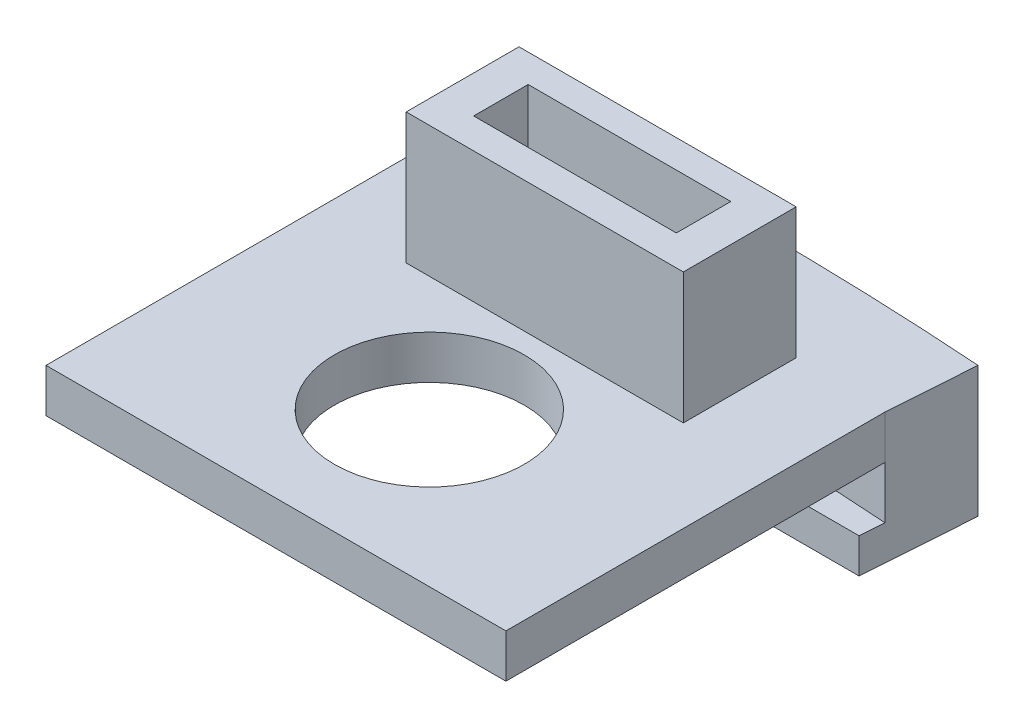
ISO-10303-21;
HEADER;
FILE_DESCRIPTION(('STEP AP214'),'2;1');
FILE_NAME('part.step','',(''),(''),'','','');
FILE_SCHEMA(('AUTOMOTIVE_DESIGN { 1 0 10303 214 1 1 1 1 }'));
ENDSEC;
DATA;
#1=APPLICATION_CONTEXT('core data for automotive mechanical design processes');
#2=APPLICATION_PROTOCOL_DEFINITION('international standard','automotive_design',2000,#1);
#3=PRODUCT_CONTEXT('',#1,'mechanical');
#4=PRODUCT('Part','Part','',(#3));
#5=PRODUCT_RELATED_PRODUCT_CATEGORY('part','',(#4));
#6=PRODUCT_DEFINITION_FORMATION('','',#4);
#7=PRODUCT_DEFINITION_CONTEXT('part definition',#1,'design');
#8=PRODUCT_DEFINITION('design','',#6,#7);
#9=PRODUCT_DEFINITION_SHAPE('','',#8);
#10=(LENGTH_UNIT() NAMED_UNIT(*) SI_UNIT(.MILLI.,.METRE.));
#11=(NAMED_UNIT(*) PLANE_ANGLE_UNIT() SI_UNIT($,.RADIAN.));
#12=(NAMED_UNIT(*) SI_UNIT($,.STERADIAN.) SOLID_ANGLE_UNIT());
#13=UNCERTAINTY_MEASURE_WITH_UNIT(LENGTH_MEASURE(1.E-05),#10,'distance_accuracy_value','');
#14=(GEOMETRIC_REPRESENTATION_CONTEXT(3) GLOBAL_UNCERTAINTY_ASSIGNED_CONTEXT((#13)) GLOBAL_UNIT_ASSIGNED_CONTEXT((#10,
#11,#12)) REPRESENTATION_CONTEXT('',''));
#15=CARTESIAN_POINT('',(0.,0.,0.));
#16=DIRECTION('',(0.,0.,1.));
#17=DIRECTION('',(1.,0.,0.));
#18=AXIS2_PLACEMENT_3D('',#15,#16,#17);
#19=CARTESIAN_POINT('',(0.,0.,0.));
#20=DIRECTION('',(0.,1.,0.));
#21=DIRECTION('',(0.,0.,1.));
#22=AXIS2_PLACEMENT_3D('',#19,#20,#21);
#23=PLANE('',#22);
#24=DIRECTION('',(1.,0.,0.));
#25=VECTOR('',#24,1.);
#26=CARTESIAN_POINT('',(0.,0.,1.9558));
#27=LINE('',#26,#25);
#28=CARTESIAN_POINT('',(-5.9055,0.,1.9558));
#29=VERTEX_POINT('',#28);
#30=CARTESIAN_POINT('',(5.9055,0.,1.9558));
#31=VERTEX_POINT('',#30);
#32=EDGE_CURVE('E173',#29,#31,#27,.T.);
#33=ORIENTED_EDGE('',*,*,#32,.F.);
#34=DIRECTION('',(0.,0.,1.));
#35=VECTOR('',#34,1.);
#36=CARTESIAN_POINT('',(-5.9055,0.,0.));
#37=LINE('',#36,#35);
#38=CARTESIAN_POINT('',(-5.9055,0.,5.1308));
#39=VERTEX_POINT('',#38);
#40=EDGE_CURVE('E154',#29,#39,#37,.T.);
#41=ORIENTED_EDGE('',*,*,#40,.T.);
#42=DIRECTION('',(1.,0.,0.));
#43=VECTOR('',#42,1.);
#44=CARTESIAN_POINT('',(0.,0.,5.1308));
#45=LINE('',#44,#43);
#46=CARTESIAN_POINT('',(5.9055,0.,5.1308));
#47=VERTEX_POINT('',#46);
#48=EDGE_CURVE('E177',#39,#47,#45,.T.);
#49=ORIENTED_EDGE('',*,*,#48,.T.);
#50=DIRECTION('',(0.,0.,1.));
#51=VECTOR('',#50,1.);
#52=CARTESIAN_POINT('',(5.9055,0.,0.));
#53=LINE('',#52,#51);
#54=EDGE_CURVE('E175',#31,#47,#53,.T.);
#55=ORIENTED_EDGE('',*,*,#54,.F.);
#56=EDGE_LOOP('',(#33,#41,#49,#55));
#57=FACE_BOUND('',#56,.T.);
#58=CARTESIAN_POINT('',(0.,0.,13.62075));
#59=DIRECTION('',(0.,1.,0.));
#60=DIRECTION('',(0.,0.,1.));
#61=AXIS2_PLACEMENT_3D('',#58,#59,#60);
#62=CIRCLE('',#61,5.53085);
#63=CARTESIAN_POINT('',(0.,0.,19.1516));
#64=VERTEX_POINT('',#63);
#65=EDGE_CURVE('E162',#64,#64,#62,.T.);
#66=ORIENTED_EDGE('',*,*,#65,.T.);
#67=EDGE_LOOP('',(#66));
#68=FACE_BOUND('',#67,.T.);
#69=CARTESIAN_POINT('',(0.,0.,192.0875));
#70=DIRECTION('',(0.,1.,0.));
#71=DIRECTION('',(0.,0.,1.));
#72=AXIS2_PLACEMENT_3D('',#69,#70,#71);
#73=CIRCLE('',#72,192.0875);
#74=CARTESIAN_POINT('',(13.3993466503233,0.,0.467915495715926));
#75=VERTEX_POINT('',#74);
#76=CARTESIAN_POINT('',(-13.3993466503233,0.,0.467915495715926));
#77=VERTEX_POINT('',#76);
#78=EDGE_CURVE('E298',#75,#77,#73,.T.);
#79=ORIENTED_EDGE('',*,*,#78,.F.);
#80=DIRECTION('',(0.,0.,1.));
#81=VECTOR('',#80,1.);
#82=CARTESIAN_POINT('',(13.3993466503233,0.,0.));
#83=LINE('',#82,#81);
#84=CARTESIAN_POINT('',(13.3993466503233,0.,22.5570249983964));
#85=VERTEX_POINT('',#84);
#86=EDGE_CURVE('E165',#75,#85,#83,.T.);
#87=ORIENTED_EDGE('',*,*,#86,.T.);
#88=DIRECTION('',(1.,0.,0.));
#89=VECTOR('',#88,1.);
#90=CARTESIAN_POINT('',(0.,0.,22.5570249983964));
#91=LINE('',#90,#89);
#92=CARTESIAN_POINT('',(-13.3993466503233,0.,22.5570249983964));
#93=VERTEX_POINT('',#92);
#94=EDGE_CURVE('E171',#93,#85,#91,.T.);
#95=ORIENTED_EDGE('',*,*,#94,.F.);
#96=DIRECTION('',(0.,0.,1.));
#97=VECTOR('',#96,1.);
#98=CARTESIAN_POINT('',(-13.3993466503233,0.,0.));
#99=LINE('',#98,#97);
#100=EDGE_CURVE('E169',#77,#93,#99,.T.);
#101=ORIENTED_EDGE('',*,*,#100,.F.);
#102=EDGE_LOOP('',(#79,#87,#95,#101));
#103=FACE_BOUND('',#102,.T.);
#104=ADVANCED_FACE('F35',(#57,#68,#103),#23,.F.);
#105=CARTESIAN_POINT('',(0.,2.54,1.9558));
#106=DIRECTION('',(0.,0.,-1.));
#107=DIRECTION('',(-1.,0.,0.));
#108=AXIS2_PLACEMENT_3D('',#105,#106,#107);
#109=PLANE('',#108);
#110=ORIENTED_EDGE('',*,*,#32,.T.);
#111=DIRECTION('',(0.,-1.,0.));
#112=VECTOR('',#111,1.);
#113=CARTESIAN_POINT('',(5.9055,2.54,1.9558));
#114=LINE('',#113,#112);
#115=CARTESIAN_POINT('',(5.9055,10.16,1.9558));
#116=VERTEX_POINT('',#115);
#117=EDGE_CURVE('E43',#116,#31,#114,.T.);
#118=ORIENTED_EDGE('',*,*,#117,.F.);
#119=DIRECTION('',(1.,0.,0.));
#120=VECTOR('',#119,1.);
#121=CARTESIAN_POINT('',(0.,10.16,1.9558));
#122=LINE('',#121,#120);
#123=CARTESIAN_POINT('',(-5.9055,10.16,1.9558));
#124=VERTEX_POINT('',#123);
#125=EDGE_CURVE('E284',#124,#116,#122,.T.);
#126=ORIENTED_EDGE('',*,*,#125,.F.);
#127=DIRECTION('',(0.,-1.,0.));
#128=VECTOR('',#127,1.);
#129=CARTESIAN_POINT('',(-5.9055,2.54,1.9558));
#130=LINE('',#129,#128);
#131=EDGE_CURVE('E90',#124,#29,#130,.T.);
#132=ORIENTED_EDGE('',*,*,#131,.T.);
#133=EDGE_LOOP('',(#110,#118,#126,#132));
#134=FACE_BOUND('',#133,.T.);
#135=ADVANCED_FACE('F359',(#134),#109,.F.);
#136=CARTESIAN_POINT('',(5.9055,2.54,0.));
#137=DIRECTION('',(1.,0.,0.));
#138=DIRECTION('',(0.,0.,-1.));
#139=AXIS2_PLACEMENT_3D('',#136,#137,#138);
#140=PLANE('',#139);
#141=ORIENTED_EDGE('',*,*,#54,.T.);
#142=DIRECTION('',(0.,-1.,0.));
#143=VECTOR('',#142,1.);
#144=CARTESIAN_POINT('',(5.9055,2.54,5.1308));
#145=LINE('',#144,#143);
#146=CARTESIAN_POINT('',(5.9055,10.16,5.1308));
#147=VERTEX_POINT('',#146);
#148=EDGE_CURVE('E151',#147,#47,#145,.T.);
#149=ORIENTED_EDGE('',*,*,#148,.F.);
#150=DIRECTION('',(0.,0.,1.));
#151=VECTOR('',#150,1.);
#152=CARTESIAN_POINT('',(5.9055,10.16,0.));
#153=LINE('',#152,#151);
#154=EDGE_CURVE('E281',#116,#147,#153,.T.);
#155=ORIENTED_EDGE('',*,*,#154,.F.);
#156=ORIENTED_EDGE('',*,*,#117,.T.);
#157=EDGE_LOOP('',(#141,#149,#155,#156));
#158=FACE_BOUND('',#157,.T.);
#159=ADVANCED_FACE('F364',(#158),#140,.F.);
#160=CARTESIAN_POINT('',(0.,2.54,5.1308));
#161=DIRECTION('',(0.,0.,-1.));
#162=DIRECTION('',(-1.,0.,0.));
#163=AXIS2_PLACEMENT_3D('',#160,#161,#162);
#164=PLANE('',#163);
#165=ORIENTED_EDGE('',*,*,#48,.F.);
#166=DIRECTION('',(0.,-1.,0.));
#167=VECTOR('',#166,1.);
#168=CARTESIAN_POINT('',(-5.9055,2.54,5.1308));
#169=LINE('',#168,#167);
#170=CARTESIAN_POINT('',(-5.9055,10.16,5.1308));
#171=VERTEX_POINT('',#170);
#172=EDGE_CURVE('E149',#171,#39,#169,.T.);
#173=ORIENTED_EDGE('',*,*,#172,.F.);
#174=DIRECTION('',(1.,0.,0.));
#175=VECTOR('',#174,1.);
#176=CARTESIAN_POINT('',(0.,10.16,5.1308));
#177=LINE('',#176,#175);
#178=EDGE_CURVE('E278',#171,#147,#177,.T.);
#179=ORIENTED_EDGE('',*,*,#178,.T.);
#180=ORIENTED_EDGE('',*,*,#148,.T.);
#181=EDGE_LOOP('',(#165,#173,#179,#180));
#182=FACE_BOUND('',#181,.T.);
#183=ADVANCED_FACE('F374',(#182),#164,.T.);
#184=CARTESIAN_POINT('',(13.3993466503233,2.54,0.));
#185=DIRECTION('',(1.,0.,0.));
#186=DIRECTION('',(0.,0.,-1.));
#187=AXIS2_PLACEMENT_3D('',#184,#185,#186);
#188=PLANE('',#187);
#189=ORIENTED_EDGE('',*,*,#86,.F.);
#190=DIRECTION('',(0.,-1.,0.));
#191=VECTOR('',#190,1.);
#192=CARTESIAN_POINT('',(13.3993466503233,2.54,0.467915495715926));
#193=LINE('',#192,#191);
#194=CARTESIAN_POINT('',(13.3993466503233,2.54,0.467915495715926));
#195=VERTEX_POINT('',#194);
#196=EDGE_CURVE('E99',#195,#75,#193,.T.);
#197=ORIENTED_EDGE('',*,*,#196,.F.);
#198=DIRECTION('',(0.,0.,1.));
#199=VECTOR('',#198,1.);
#200=CARTESIAN_POINT('',(13.3993466503233,2.54,0.));
#201=LINE('',#200,#199);
#202=CARTESIAN_POINT('',(13.3993466503233,2.54,22.5570249983964));
#203=VERTEX_POINT('',#202);
#204=EDGE_CURVE('E185',#195,#203,#201,.T.);
#205=ORIENTED_EDGE('',*,*,#204,.T.);
#206=DIRECTION('',(0.,-1.,0.));
#207=VECTOR('',#206,1.);
#208=CARTESIAN_POINT('',(13.3993466503233,2.54,22.5570249983964));
#209=LINE('',#208,#207);
#210=EDGE_CURVE('E141',#203,#85,#209,.T.);
#211=ORIENTED_EDGE('',*,*,#210,.T.);
#212=EDGE_LOOP('',(#189,#197,#205,#211));
#213=FACE_BOUND('',#212,.T.);
#214=ADVANCED_FACE('F343',(#213),#188,.T.);
#215=CARTESIAN_POINT('',(13.3667065153319,2.54,0.934691172801612));
#216=DIRECTION('',(0.997564050259825,0.,0.0697564737441179));
#217=DIRECTION('',(0.0697564737441179,0.,-0.997564050259825));
#218=AXIS2_PLACEMENT_3D('',#215,#216,#217);
#219=PLANE('',#218);
#220=DIRECTION('',(0.,1.,0.));
#221=VECTOR('',#220,1.);
#222=CARTESIAN_POINT('',(13.3993466503233,-5.08,0.467915495715926));
#223=LINE('',#222,#221);
#224=CARTESIAN_POINT('',(13.3993466503233,-3.048,0.467915495715926));
#225=VERTEX_POINT('',#224);
#226=EDGE_CURVE('E294',#225,#75,#223,.T.);
#227=ORIENTED_EDGE('',*,*,#226,.F.);
#228=DIRECTION('',(-0.0697564737441179,0.,0.997564050259825));
#229=VECTOR('',#228,1.);
#230=CARTESIAN_POINT('',(13.7535788992914,-3.048,-4.59784167414245));
#231=LINE('',#230,#229);
#232=CARTESIAN_POINT('',(13.3006711291802,-3.048,1.87904119129026));
#233=VERTEX_POINT('',#232);
#234=EDGE_CURVE('E314',#225,#233,#231,.T.);
#235=ORIENTED_EDGE('',*,*,#234,.T.);
#236=DIRECTION('',(0.,-1.,0.));
#237=VECTOR('',#236,1.);
#238=CARTESIAN_POINT('',(13.3006711291802,-3.048,1.87904119129026));
#239=LINE('',#238,#237);
#240=CARTESIAN_POINT('',(13.3006711291802,-5.08,1.87904119129026));
#241=VERTEX_POINT('',#240);
#242=EDGE_CURVE('E306',#233,#241,#239,.T.);
#243=ORIENTED_EDGE('',*,*,#242,.T.);
#244=DIRECTION('',(-0.0697564737441179,0.,0.997564050259825));
#245=VECTOR('',#244,1.);
#246=CARTESIAN_POINT('',(13.3667065153319,-5.08,0.934691172801612));
#247=LINE('',#246,#245);
#248=CARTESIAN_POINT('',(13.7535788992914,-5.08,-4.59784167414245));
#249=VERTEX_POINT('',#248);
#250=EDGE_CURVE('E296',#249,#241,#247,.T.);
#251=ORIENTED_EDGE('',*,*,#250,.F.);
#252=DIRECTION('',(0.,-1.,0.));
#253=VECTOR('',#252,1.);
#254=CARTESIAN_POINT('',(13.7535788992914,2.54,-4.59784167414245));
#255=LINE('',#254,#253);
#256=CARTESIAN_POINT('',(13.7535788992914,2.54,-4.59784167414245));
#257=VERTEX_POINT('',#256);
#258=EDGE_CURVE('E139',#257,#249,#255,.T.);
#259=ORIENTED_EDGE('',*,*,#258,.F.);
#260=DIRECTION('',(-0.0697564737441179,0.,0.997564050259825));
#261=VECTOR('',#260,1.);
#262=CARTESIAN_POINT('',(13.3667065153319,2.54,0.934691172801612));
#263=LINE('',#262,#261);
#264=EDGE_CURVE('E189',#257,#195,#263,.T.);
#265=ORIENTED_EDGE('',*,*,#264,.T.);
#266=ORIENTED_EDGE('',*,*,#196,.T.);
#267=EDGE_LOOP('',(#227,#235,#243,#251,#259,#265,#266));
#268=FACE_BOUND('',#267,.T.);
#269=ADVANCED_FACE('F323',(#268),#219,.T.);
#270=CARTESIAN_POINT('',(0.,2.54,192.0875));
#271=DIRECTION('',(0.,-1.,0.));
#272=DIRECTION('',(0.,0.,-1.));
#273=AXIS2_PLACEMENT_3D('',#270,#271,#272);
#274=CYLINDRICAL_SURFACE('',#273,197.165627232571);
#275=ORIENTED_EDGE('',*,*,#258,.T.);
#276=CARTESIAN_POINT('',(0.,-5.08,192.0875));
#277=DIRECTION('',(0.,1.,0.));
#278=DIRECTION('',(0.,0.,1.));
#279=AXIS2_PLACEMENT_3D('',#276,#277,#278);
#280=CIRCLE('',#279,197.165627232571);
#281=CARTESIAN_POINT('',(-13.7535788992915,-5.08,-4.59784167414245));
#282=VERTEX_POINT('',#281);
#283=EDGE_CURVE('E202',#282,#249,#280,.F.);
#284=ORIENTED_EDGE('',*,*,#283,.F.);
#285=DIRECTION('',(0.,-1.,0.));
#286=VECTOR('',#285,1.);
#287=CARTESIAN_POINT('',(-13.7535788992915,2.54,-4.59784167414245));
#288=LINE('',#287,#286);
#289=CARTESIAN_POINT('',(-13.7535788992915,2.54,-4.59784167414245));
#290=VERTEX_POINT('',#289);
#291=EDGE_CURVE('E137',#290,#282,#288,.T.);
#292=ORIENTED_EDGE('',*,*,#291,.F.);
#293=CARTESIAN_POINT('',(0.,2.54,192.0875));
#294=DIRECTION('',(0.,1.,0.));
#295=DIRECTION('',(0.,0.,1.));
#296=AXIS2_PLACEMENT_3D('',#293,#294,#295);
#297=CIRCLE('',#296,197.165627232571);
#298=EDGE_CURVE('E128',#290,#257,#297,.F.);
#299=ORIENTED_EDGE('',*,*,#298,.T.);
#300=EDGE_LOOP('',(#275,#284,#292,#299));
#301=FACE_BOUND('',#300,.T.);
#302=ADVANCED_FACE('F196',(#301),#274,.T.);
#303=CARTESIAN_POINT('',(-13.366706515332,2.54,0.934691172801615));
#304=DIRECTION('',(0.997564050259825,0.,-0.0697564737441179));
#305=DIRECTION('',(-0.0697564737441179,0.,-0.997564050259825));
#306=AXIS2_PLACEMENT_3D('',#303,#304,#305);
#307=PLANE('',#306);
#308=ORIENTED_EDGE('',*,*,#291,.T.);
#309=DIRECTION('',(0.0697564737441179,0.,0.997564050259825));
#310=VECTOR('',#309,1.);
#311=CARTESIAN_POINT('',(-13.366706515332,-5.08,0.934691172801615));
#312=LINE('',#311,#310);
#313=CARTESIAN_POINT('',(-13.3006711291803,-5.08,1.87904119129026));
#314=VERTEX_POINT('',#313);
#315=EDGE_CURVE('E207',#282,#314,#312,.T.);
#316=ORIENTED_EDGE('',*,*,#315,.T.);
#317=DIRECTION('',(0.,-1.,0.));
#318=VECTOR('',#317,1.);
#319=CARTESIAN_POINT('',(-13.3006711291803,-3.048,1.87904119129026));
#320=LINE('',#319,#318);
#321=CARTESIAN_POINT('',(-13.3006711291803,-3.048,1.87904119129026));
#322=VERTEX_POINT('',#321);
#323=EDGE_CURVE('E301',#322,#314,#320,.T.);
#324=ORIENTED_EDGE('',*,*,#323,.F.);
#325=DIRECTION('',(-0.0697564737441189,0.,-0.997564050259825));
#326=VECTOR('',#325,1.);
#327=CARTESIAN_POINT('',(-13.3993466503233,-3.048,0.467915495715926));
#328=LINE('',#327,#326);
#329=CARTESIAN_POINT('',(-13.3993466503233,-3.048,0.467915495715926));
#330=VERTEX_POINT('',#329);
#331=EDGE_CURVE('E309',#322,#330,#328,.T.);
#332=ORIENTED_EDGE('',*,*,#331,.T.);
#333=DIRECTION('',(0.,1.,0.));
#334=VECTOR('',#333,1.);
#335=CARTESIAN_POINT('',(-13.3993466503233,-5.08,0.467915495715926));
#336=LINE('',#335,#334);
#337=EDGE_CURVE('E136',#330,#77,#336,.T.);
#338=ORIENTED_EDGE('',*,*,#337,.T.);
#339=DIRECTION('',(0.,-1.,0.));
#340=VECTOR('',#339,1.);
#341=CARTESIAN_POINT('',(-13.3993466503233,2.54,0.467915495715926));
#342=LINE('',#341,#340);
#343=CARTESIAN_POINT('',(-13.3993466503233,2.54,0.467915495715926));
#344=VERTEX_POINT('',#343);
#345=EDGE_CURVE('E117',#344,#77,#342,.T.);
#346=ORIENTED_EDGE('',*,*,#345,.F.);
#347=DIRECTION('',(0.0697564737441179,0.,0.997564050259825));
#348=VECTOR('',#347,1.);
#349=CARTESIAN_POINT('',(-13.366706515332,2.54,0.934691172801615));
#350=LINE('',#349,#348);
#351=EDGE_CURVE('E121',#290,#344,#350,.T.);
#352=ORIENTED_EDGE('',*,*,#351,.F.);
#353=EDGE_LOOP('',(#308,#316,#324,#332,#338,#346,#352));
#354=FACE_BOUND('',#353,.T.);
#355=ADVANCED_FACE('F133',(#354),#307,.F.);
#356=CARTESIAN_POINT('',(-13.3993466503233,2.54,0.));
#357=DIRECTION('',(1.,0.,0.));
#358=DIRECTION('',(0.,0.,-1.));
#359=AXIS2_PLACEMENT_3D('',#356,#357,#358);
#360=PLANE('',#359);
#361=ORIENTED_EDGE('',*,*,#100,.T.);
#362=DIRECTION('',(0.,-1.,0.));
#363=VECTOR('',#362,1.);
#364=CARTESIAN_POINT('',(-13.3993466503233,2.54,22.5570249983964));
#365=LINE('',#364,#363);
#366=CARTESIAN_POINT('',(-13.3993466503233,2.54,22.5570249983964));
#367=VERTEX_POINT('',#366);
#368=EDGE_CURVE('E120',#367,#93,#365,.T.);
#369=ORIENTED_EDGE('',*,*,#368,.F.);
#370=DIRECTION('',(0.,0.,1.));
#371=VECTOR('',#370,1.);
#372=CARTESIAN_POINT('',(-13.3993466503233,2.54,0.));
#373=LINE('',#372,#371);
#374=EDGE_CURVE('E111',#344,#367,#373,.T.);
#375=ORIENTED_EDGE('',*,*,#374,.F.);
#376=ORIENTED_EDGE('',*,*,#345,.T.);
#377=EDGE_LOOP('',(#361,#369,#375,#376));
#378=FACE_BOUND('',#377,.T.);
#379=ADVANCED_FACE('F114',(#378),#360,.F.);
#380=CARTESIAN_POINT('',(0.,2.54,22.5570249983964));
#381=DIRECTION('',(0.,0.,-1.));
#382=DIRECTION('',(-1.,0.,0.));
#383=AXIS2_PLACEMENT_3D('',#380,#381,#382);
#384=PLANE('',#383);
#385=ORIENTED_EDGE('',*,*,#94,.T.);
#386=ORIENTED_EDGE('',*,*,#210,.F.);
#387=DIRECTION('',(1.,0.,0.));
#388=VECTOR('',#387,1.);
#389=CARTESIAN_POINT('',(0.,2.54,22.5570249983964));
#390=LINE('',#389,#388);
#391=EDGE_CURVE('E59',#367,#203,#390,.T.);
#392=ORIENTED_EDGE('',*,*,#391,.F.);
#393=ORIENTED_EDGE('',*,*,#368,.T.);
#394=EDGE_LOOP('',(#385,#386,#392,#393));
#395=FACE_BOUND('',#394,.T.);
#396=ADVANCED_FACE('F342',(#395),#384,.F.);
#397=CARTESIAN_POINT('',(0.,2.54,13.62075));
#398=DIRECTION('',(0.,-1.,0.));
#399=DIRECTION('',(0.,0.,-1.));
#400=AXIS2_PLACEMENT_3D('',#397,#398,#399);
#401=CYLINDRICAL_SURFACE('',#400,5.53085);
#402=CARTESIAN_POINT('',(0.,2.54,13.62075));
#403=DIRECTION('',(0.,1.,0.));
#404=DIRECTION('',(0.,0.,1.));
#405=AXIS2_PLACEMENT_3D('',#402,#403,#404);
#406=CIRCLE('',#405,5.53085);
#407=CARTESIAN_POINT('',(0.,2.54,19.1516));
#408=VERTEX_POINT('',#407);
#409=EDGE_CURVE('E182',#408,#408,#406,.T.);
#410=ORIENTED_EDGE('',*,*,#409,.T.);
#411=EDGE_LOOP('',(#410));
#412=FACE_BOUND('',#411,.T.);
#413=ORIENTED_EDGE('',*,*,#65,.F.);
#414=EDGE_LOOP('',(#413));
#415=FACE_BOUND('',#414,.T.);
#416=ADVANCED_FACE('F37',(#412,#415),#401,.F.);
#417=CARTESIAN_POINT('',(-5.9055,2.54,0.));
#418=DIRECTION('',(1.,0.,0.));
#419=DIRECTION('',(0.,0.,-1.));
#420=AXIS2_PLACEMENT_3D('',#417,#418,#419);
#421=PLANE('',#420);
#422=ORIENTED_EDGE('',*,*,#40,.F.);
#423=ORIENTED_EDGE('',*,*,#131,.F.);
#424=DIRECTION('',(0.,0.,1.));
#425=VECTOR('',#424,1.);
#426=CARTESIAN_POINT('',(-5.9055,10.16,0.));
#427=LINE('',#426,#425);
#428=EDGE_CURVE('E275',#124,#171,#427,.T.);
#429=ORIENTED_EDGE('',*,*,#428,.T.);
#430=ORIENTED_EDGE('',*,*,#172,.T.);
#431=EDGE_LOOP('',(#422,#423,#429,#430));
#432=FACE_BOUND('',#431,.T.);
#433=ADVANCED_FACE('F370',(#432),#421,.T.);
#434=CARTESIAN_POINT('',(0.,2.54,0.));
#435=DIRECTION('',(0.,1.,0.));
#436=DIRECTION('',(0.,0.,1.));
#437=AXIS2_PLACEMENT_3D('',#434,#435,#436);
#438=PLANE('',#437);
#439=DIRECTION('',(0.,0.,-1.));
#440=VECTOR('',#439,1.);
#441=CARTESIAN_POINT('',(8.07507128334694,2.54,0.));
#442=LINE('',#441,#440);
#443=CARTESIAN_POINT('',(8.07507128334694,2.54,6.89416892167906));
#444=VERTEX_POINT('',#443);
#445=CARTESIAN_POINT('',(8.07507128334694,2.54,0.319431078320941));
#446=VERTEX_POINT('',#445);
#447=EDGE_CURVE('E166',#444,#446,#442,.T.);
#448=ORIENTED_EDGE('',*,*,#447,.F.);
#449=DIRECTION('',(-1.,0.,0.));
#450=VECTOR('',#449,1.);
#451=CARTESIAN_POINT('',(0.,2.54,6.89416892167906));
#452=LINE('',#451,#450);
#453=CARTESIAN_POINT('',(-8.07507128334694,2.54,6.89416892167906));
#454=VERTEX_POINT('',#453);
#455=EDGE_CURVE('E263',#444,#454,#452,.T.);
#456=ORIENTED_EDGE('',*,*,#455,.T.);
#457=DIRECTION('',(0.,0.,-1.));
#458=VECTOR('',#457,1.);
#459=CARTESIAN_POINT('',(-8.07507128334694,2.54,0.));
#460=LINE('',#459,#458);
#461=CARTESIAN_POINT('',(-8.07507128334694,2.54,0.319431078320941));
#462=VERTEX_POINT('',#461);
#463=EDGE_CURVE('E268',#454,#462,#460,.T.);
#464=ORIENTED_EDGE('',*,*,#463,.T.);
#465=DIRECTION('',(-1.,0.,0.));
#466=VECTOR('',#465,1.);
#467=CARTESIAN_POINT('',(0.,2.54,0.319431078320941));
#468=LINE('',#467,#466);
#469=EDGE_CURVE('E245',#446,#462,#468,.T.);
#470=ORIENTED_EDGE('',*,*,#469,.F.);
#471=EDGE_LOOP('',(#448,#456,#464,#470));
#472=FACE_BOUND('',#471,.T.);
#473=ORIENTED_EDGE('',*,*,#409,.F.);
#474=EDGE_LOOP('',(#473));
#475=FACE_BOUND('',#474,.T.);
#476=ORIENTED_EDGE('',*,*,#204,.F.);
#477=ORIENTED_EDGE('',*,*,#264,.F.);
#478=ORIENTED_EDGE('',*,*,#298,.F.);
#479=ORIENTED_EDGE('',*,*,#351,.T.);
#480=ORIENTED_EDGE('',*,*,#374,.T.);
#481=ORIENTED_EDGE('',*,*,#391,.T.);
#482=EDGE_LOOP('',(#476,#477,#478,#479,#480,#481));
#483=FACE_BOUND('',#482,.T.);
#484=ADVANCED_FACE('F125',(#472,#475,#483),#438,.T.);
#485=CARTESIAN_POINT('',(8.07507128334694,10.16,0.));
#486=DIRECTION('',(1.,0.,0.));
#487=DIRECTION('',(0.,0.,-1.));
#488=AXIS2_PLACEMENT_3D('',#485,#486,#487);
#489=PLANE('',#488);
#490=DIRECTION('',(0.,-1.,0.));
#491=VECTOR('',#490,1.);
#492=CARTESIAN_POINT('',(8.07507128334694,10.16,6.89416892167906));
#493=LINE('',#492,#491);
#494=CARTESIAN_POINT('',(8.07507128334694,10.16,6.89416892167906));
#495=VERTEX_POINT('',#494);
#496=EDGE_CURVE('E256',#495,#444,#493,.T.);
#497=ORIENTED_EDGE('',*,*,#496,.T.);
#498=ORIENTED_EDGE('',*,*,#447,.T.);
#499=DIRECTION('',(0.,-1.,0.));
#500=VECTOR('',#499,1.);
#501=CARTESIAN_POINT('',(8.07507128334694,10.16,0.319431078320941));
#502=LINE('',#501,#500);
#503=CARTESIAN_POINT('',(8.07507128334694,10.16,0.319431078320941));
#504=VERTEX_POINT('',#503);
#505=EDGE_CURVE('E253',#504,#446,#502,.T.);
#506=ORIENTED_EDGE('',*,*,#505,.F.);
#507=DIRECTION('',(0.,0.,1.));
#508=VECTOR('',#507,1.);
#509=CARTESIAN_POINT('',(8.07507128334694,10.16,0.));
#510=LINE('',#509,#508);
#511=EDGE_CURVE('E292',#504,#495,#510,.T.);
#512=ORIENTED_EDGE('',*,*,#511,.T.);
#513=EDGE_LOOP('',(#497,#498,#506,#512));
#514=FACE_BOUND('',#513,.T.);
#515=ADVANCED_FACE('F251',(#514),#489,.T.);
#516=CARTESIAN_POINT('',(0.,10.16,0.319431078320941));
#517=DIRECTION('',(0.,0.,-1.));
#518=DIRECTION('',(-1.,0.,0.));
#519=AXIS2_PLACEMENT_3D('',#516,#517,#518);
#520=PLANE('',#519);
#521=ORIENTED_EDGE('',*,*,#505,.T.);
#522=ORIENTED_EDGE('',*,*,#469,.T.);
#523=DIRECTION('',(0.,-1.,0.));
#524=VECTOR('',#523,1.);
#525=CARTESIAN_POINT('',(-8.07507128334694,10.16,0.319431078320941));
#526=LINE('',#525,#524);
#527=CARTESIAN_POINT('',(-8.07507128334694,10.16,0.319431078320941));
#528=VERTEX_POINT('',#527);
#529=EDGE_CURVE('E264',#528,#462,#526,.T.);
#530=ORIENTED_EDGE('',*,*,#529,.F.);
#531=DIRECTION('',(1.,0.,0.));
#532=VECTOR('',#531,1.);
#533=CARTESIAN_POINT('',(0.,10.16,0.319431078320941));
#534=LINE('',#533,#532);
#535=EDGE_CURVE('E262',#528,#504,#534,.T.);
#536=ORIENTED_EDGE('',*,*,#535,.T.);
#537=EDGE_LOOP('',(#521,#522,#530,#536));
#538=FACE_BOUND('',#537,.T.);
#539=ADVANCED_FACE('F260',(#538),#520,.T.);
#540=CARTESIAN_POINT('',(-8.07507128334694,10.16,0.));
#541=DIRECTION('',(1.,0.,0.));
#542=DIRECTION('',(0.,0.,-1.));
#543=AXIS2_PLACEMENT_3D('',#540,#541,#542);
#544=PLANE('',#543);
#545=ORIENTED_EDGE('',*,*,#463,.F.);
#546=DIRECTION('',(0.,-1.,0.));
#547=VECTOR('',#546,1.);
#548=CARTESIAN_POINT('',(-8.07507128334694,10.16,6.89416892167906));
#549=LINE('',#548,#547);
#550=CARTESIAN_POINT('',(-8.07507128334694,10.16,6.89416892167906));
#551=VERTEX_POINT('',#550);
#552=EDGE_CURVE('E50',#551,#454,#549,.T.);
#553=ORIENTED_EDGE('',*,*,#552,.F.);
#554=DIRECTION('',(0.,0.,1.));
#555=VECTOR('',#554,1.);
#556=CARTESIAN_POINT('',(-8.07507128334694,10.16,0.));
#557=LINE('',#556,#555);
#558=EDGE_CURVE('E289',#528,#551,#557,.T.);
#559=ORIENTED_EDGE('',*,*,#558,.F.);
#560=ORIENTED_EDGE('',*,*,#529,.T.);
#561=EDGE_LOOP('',(#545,#553,#559,#560));
#562=FACE_BOUND('',#561,.T.);
#563=ADVANCED_FACE('F442',(#562),#544,.F.);
#564=CARTESIAN_POINT('',(0.,10.16,6.89416892167906));
#565=DIRECTION('',(0.,0.,-1.));
#566=DIRECTION('',(-1.,0.,0.));
#567=AXIS2_PLACEMENT_3D('',#564,#565,#566);
#568=PLANE('',#567);
#569=ORIENTED_EDGE('',*,*,#455,.F.);
#570=ORIENTED_EDGE('',*,*,#496,.F.);
#571=DIRECTION('',(1.,0.,0.));
#572=VECTOR('',#571,1.);
#573=CARTESIAN_POINT('',(0.,10.16,6.89416892167906));
#574=LINE('',#573,#572);
#575=EDGE_CURVE('E287',#551,#495,#574,.T.);
#576=ORIENTED_EDGE('',*,*,#575,.F.);
#577=ORIENTED_EDGE('',*,*,#552,.T.);
#578=EDGE_LOOP('',(#569,#570,#576,#577));
#579=FACE_BOUND('',#578,.T.);
#580=ADVANCED_FACE('F449',(#579),#568,.F.);
#581=CARTESIAN_POINT('',(0.,10.16,0.));
#582=DIRECTION('',(0.,1.,0.));
#583=DIRECTION('',(0.,0.,1.));
#584=AXIS2_PLACEMENT_3D('',#581,#582,#583);
#585=PLANE('',#584);
#586=ORIENTED_EDGE('',*,*,#511,.F.);
#587=ORIENTED_EDGE('',*,*,#535,.F.);
#588=ORIENTED_EDGE('',*,*,#558,.T.);
#589=ORIENTED_EDGE('',*,*,#575,.T.);
#590=EDGE_LOOP('',(#586,#587,#588,#589));
#591=FACE_BOUND('',#590,.T.);
#592=ORIENTED_EDGE('',*,*,#125,.T.);
#593=ORIENTED_EDGE('',*,*,#154,.T.);
#594=ORIENTED_EDGE('',*,*,#178,.F.);
#595=ORIENTED_EDGE('',*,*,#428,.F.);
#596=EDGE_LOOP('',(#592,#593,#594,#595));
#597=FACE_BOUND('',#596,.T.);
#598=ADVANCED_FACE('F355',(#591,#597),#585,.T.);
#599=CARTESIAN_POINT('',(0.,-5.08,192.0875));
#600=DIRECTION('',(0.,1.,0.));
#601=DIRECTION('',(0.,0.,1.));
#602=AXIS2_PLACEMENT_3D('',#599,#600,#601);
#603=CYLINDRICAL_SURFACE('',#602,192.0875);
#604=ORIENTED_EDGE('',*,*,#337,.F.);
#605=CARTESIAN_POINT('',(0.,-3.048,192.0875));
#606=DIRECTION('',(0.,1.,0.));
#607=DIRECTION('',(0.,0.,1.));
#608=AXIS2_PLACEMENT_3D('',#605,#606,#607);
#609=CIRCLE('',#608,192.0875);
#610=EDGE_CURVE('E11',#330,#225,#609,.F.);
#611=ORIENTED_EDGE('',*,*,#610,.T.);
#612=ORIENTED_EDGE('',*,*,#226,.T.);
#613=ORIENTED_EDGE('',*,*,#78,.T.);
#614=EDGE_LOOP('',(#604,#611,#612,#613));
#615=FACE_BOUND('',#614,.T.);
#616=ADVANCED_FACE('F338',(#615),#603,.F.);
#617=CARTESIAN_POINT('',(0.,-5.08,0.));
#618=DIRECTION('',(0.,1.,0.));
#619=DIRECTION('',(0.,0.,1.));
#620=AXIS2_PLACEMENT_3D('',#617,#618,#619);
#621=PLANE('',#620);
#622=ORIENTED_EDGE('',*,*,#283,.T.);
#623=ORIENTED_EDGE('',*,*,#250,.T.);
#624=DIRECTION('',(-1.,0.,0.));
#625=VECTOR('',#624,1.);
#626=CARTESIAN_POINT('',(-13.3006711291803,-5.08,1.87904119129026));
#627=LINE('',#626,#625);
#628=EDGE_CURVE('E311',#241,#314,#627,.T.);
#629=ORIENTED_EDGE('',*,*,#628,.T.);
#630=ORIENTED_EDGE('',*,*,#315,.F.);
#631=EDGE_LOOP('',(#622,#623,#629,#630));
#632=FACE_BOUND('',#631,.T.);
#633=ADVANCED_FACE('F345',(#632),#621,.F.);
#634=CARTESIAN_POINT('',(0.,-3.048,0.));
#635=DIRECTION('',(0.,1.,0.));
#636=DIRECTION('',(0.,0.,1.));
#637=AXIS2_PLACEMENT_3D('',#634,#635,#636);
#638=PLANE('',#637);
#639=ORIENTED_EDGE('',*,*,#610,.F.);
#640=ORIENTED_EDGE('',*,*,#331,.F.);
#641=DIRECTION('',(-1.,0.,0.));
#642=VECTOR('',#641,1.);
#643=CARTESIAN_POINT('',(-13.3006711291803,-3.048,1.87904119129026));
#644=LINE('',#643,#642);
#645=EDGE_CURVE('E316',#233,#322,#644,.T.);
#646=ORIENTED_EDGE('',*,*,#645,.F.);
#647=ORIENTED_EDGE('',*,*,#234,.F.);
#648=EDGE_LOOP('',(#639,#640,#646,#647));
#649=FACE_BOUND('',#648,.T.);
#650=ADVANCED_FACE('F335',(#649),#638,.T.);
#651=CARTESIAN_POINT('',(-13.3006711291803,-3.048,1.87904119129026));
#652=DIRECTION('',(0.,0.,1.));
#653=DIRECTION('',(1.,0.,0.));
#654=AXIS2_PLACEMENT_3D('',#651,#652,#653);
#655=PLANE('',#654);
#656=ORIENTED_EDGE('',*,*,#628,.F.);
#657=ORIENTED_EDGE('',*,*,#242,.F.);
#658=ORIENTED_EDGE('',*,*,#645,.T.);
#659=ORIENTED_EDGE('',*,*,#323,.T.);
#660=EDGE_LOOP('',(#656,#657,#658,#659));
#661=FACE_BOUND('',#660,.T.);
#662=ADVANCED_FACE('F333',(#661),#655,.T.);
#663=CLOSED_SHELL('',(#104,#135,#159,#183,#214,#269,#302,#355,#379,#396,#416,#433,#484,#515,
#539,#563,#580,#598,#616,#633,#650,#662));
#664=MANIFOLD_SOLID_BREP('B2',#663);
#665=ADVANCED_BREP_SHAPE_REPRESENTATION('',(#18,#664),#14);
#666=SHAPE_DEFINITION_REPRESENTATION(#9,#665);
ENDSEC;
END-ISO-10303-21;
